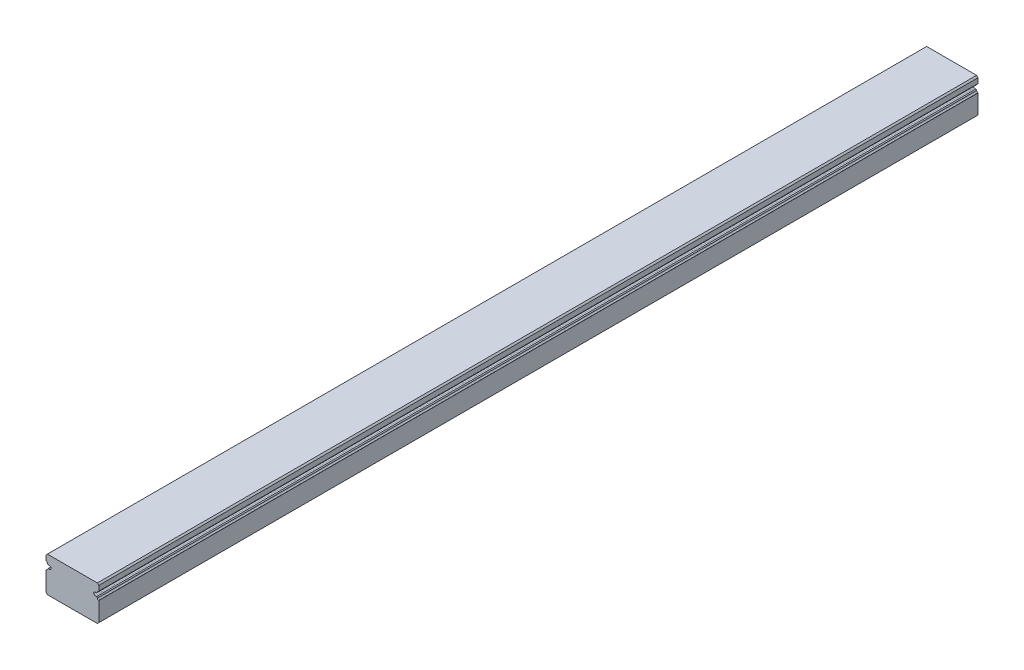
ISO-10303-21;
HEADER;
FILE_DESCRIPTION(('STEP AP214'),'2;1');
FILE_NAME('part.step','',(''),(''),'','','');
FILE_SCHEMA(('AUTOMOTIVE_DESIGN { 1 0 10303 214 1 1 1 1 }'));
ENDSEC;
DATA;
#1=APPLICATION_CONTEXT('core data for automotive mechanical design processes');
#2=APPLICATION_PROTOCOL_DEFINITION('international standard','automotive_design',2000,#1);
#3=PRODUCT_CONTEXT('',#1,'mechanical');
#4=PRODUCT('Part','Part','',(#3));
#5=PRODUCT_RELATED_PRODUCT_CATEGORY('part','',(#4));
#6=PRODUCT_DEFINITION_FORMATION('','',#4);
#7=PRODUCT_DEFINITION_CONTEXT('part definition',#1,'design');
#8=PRODUCT_DEFINITION('design','',#6,#7);
#9=PRODUCT_DEFINITION_SHAPE('','',#8);
#10=(LENGTH_UNIT() NAMED_UNIT(*) SI_UNIT(.MILLI.,.METRE.));
#11=(NAMED_UNIT(*) PLANE_ANGLE_UNIT() SI_UNIT($,.RADIAN.));
#12=(NAMED_UNIT(*) SI_UNIT($,.STERADIAN.) SOLID_ANGLE_UNIT());
#13=UNCERTAINTY_MEASURE_WITH_UNIT(LENGTH_MEASURE(1.E-05),#10,'distance_accuracy_value','');
#14=(GEOMETRIC_REPRESENTATION_CONTEXT(3) GLOBAL_UNCERTAINTY_ASSIGNED_CONTEXT((#13)) GLOBAL_UNIT_ASSIGNED_CONTEXT((#10,
#11,#12)) REPRESENTATION_CONTEXT('',''));
#15=CARTESIAN_POINT('',(0.,0.,0.));
#16=DIRECTION('',(0.,0.,1.));
#17=DIRECTION('',(1.,0.,0.));
#18=AXIS2_PLACEMENT_3D('',#15,#16,#17);
#19=CARTESIAN_POINT('',(7.51952374116363,1.28819952474976,125.));
#20=DIRECTION('',(0.,0.,-1.));
#21=DIRECTION('',(-1.,0.,0.));
#22=AXIS2_PLACEMENT_3D('',#19,#20,#21);
#23=CYLINDRICAL_SURFACE('',#22,0.400000000000003);
#24=CARTESIAN_POINT('',(7.51952374116363,1.28819952474976,-125.));
#25=DIRECTION('',(0.,0.,-1.));
#26=DIRECTION('',(1.,0.,0.));
#27=AXIS2_PLACEMENT_3D('',#24,#25,#26);
#28=CIRCLE('',#27,0.400000000000003);
#29=CARTESIAN_POINT('',(7.4639299734,0.8920816976,-125.));
#30=VERTEX_POINT('',#29);
#31=CARTESIAN_POINT('',(7.1195635475,1.2938425279,-125.));
#32=VERTEX_POINT('',#31);
#33=EDGE_CURVE('E250',#30,#32,#28,.T.);
#34=ORIENTED_EDGE('',*,*,#33,.T.);
#35=DIRECTION('',(0.,0.,-1.));
#36=VECTOR('',#35,1.);
#37=CARTESIAN_POINT('',(7.1195635475,1.2938425279,125.));
#38=LINE('',#37,#36);
#39=CARTESIAN_POINT('',(7.1195635475,1.2938425279,125.));
#40=VERTEX_POINT('',#39);
#41=EDGE_CURVE('E11',#40,#32,#38,.T.);
#42=ORIENTED_EDGE('',*,*,#41,.F.);
#43=CARTESIAN_POINT('',(7.51952374116363,1.28819952474976,125.));
#44=DIRECTION('',(0.,0.,-1.));
#45=DIRECTION('',(1.,0.,0.));
#46=AXIS2_PLACEMENT_3D('',#43,#44,#45);
#47=CIRCLE('',#46,0.400000000000003);
#48=CARTESIAN_POINT('',(7.4639299734,0.8920816976,125.));
#49=VERTEX_POINT('',#48);
#50=EDGE_CURVE('E304',#49,#40,#47,.T.);
#51=ORIENTED_EDGE('',*,*,#50,.F.);
#52=DIRECTION('',(0.,0.,-1.));
#53=VECTOR('',#52,1.);
#54=CARTESIAN_POINT('',(7.4639299734,0.8920816976,125.));
#55=LINE('',#54,#53);
#56=EDGE_CURVE('E246',#49,#30,#55,.T.);
#57=ORIENTED_EDGE('',*,*,#56,.T.);
#58=EDGE_LOOP('',(#34,#42,#51,#57));
#59=FACE_BOUND('',#58,.T.);
#60=ADVANCED_FACE('F34',(#59),#23,.F.);
#61=CARTESIAN_POINT('',(7.1195635475,1.2938425279,125.));
#62=DIRECTION('',(-0.759256602386219,-0.650791373431559,0.));
#63=DIRECTION('',(0.650791373431559,-0.759256602386219,0.));
#64=AXIS2_PLACEMENT_3D('',#61,#62,#63);
#65=PLANE('',#64);
#66=DIRECTION('',(-0.650791373431559,0.759256602386219,0.));
#67=VECTOR('',#66,1.);
#68=CARTESIAN_POINT('',(7.1195635475,1.2938425279,-125.));
#69=LINE('',#68,#67);
#70=CARTESIAN_POINT('',(6.9,1.55,-125.));
#71=VERTEX_POINT('',#70);
#72=EDGE_CURVE('E253',#32,#71,#69,.T.);
#73=ORIENTED_EDGE('',*,*,#72,.T.);
#74=DIRECTION('',(0.,0.,-1.));
#75=VECTOR('',#74,1.);
#76=CARTESIAN_POINT('',(6.9,1.55,125.));
#77=LINE('',#76,#75);
#78=CARTESIAN_POINT('',(6.9,1.55,125.));
#79=VERTEX_POINT('',#78);
#80=EDGE_CURVE('E42',#79,#71,#77,.T.);
#81=ORIENTED_EDGE('',*,*,#80,.F.);
#82=DIRECTION('',(-0.650791373431559,0.759256602386219,0.));
#83=VECTOR('',#82,1.);
#84=CARTESIAN_POINT('',(7.1195635475,1.2938425279,125.));
#85=LINE('',#84,#83);
#86=EDGE_CURVE('E153',#40,#79,#85,.T.);
#87=ORIENTED_EDGE('',*,*,#86,.F.);
#88=ORIENTED_EDGE('',*,*,#41,.T.);
#89=EDGE_LOOP('',(#73,#81,#87,#88));
#90=FACE_BOUND('',#89,.T.);
#91=ADVANCED_FACE('F462',(#90),#65,.F.);
#92=CARTESIAN_POINT('',(6.9,1.55,125.));
#93=DIRECTION('',(0.,-1.,0.));
#94=DIRECTION('',(0.,0.,-1.));
#95=AXIS2_PLACEMENT_3D('',#92,#93,#94);
#96=PLANE('',#95);
#97=DIRECTION('',(-1.,0.,0.));
#98=VECTOR('',#97,1.);
#99=CARTESIAN_POINT('',(6.9,1.55,-125.));
#100=LINE('',#99,#98);
#101=CARTESIAN_POINT('',(6.5,1.55,-125.));
#102=VERTEX_POINT('',#101);
#103=EDGE_CURVE('E255',#71,#102,#100,.T.);
#104=ORIENTED_EDGE('',*,*,#103,.T.);
#105=DIRECTION('',(0.,0.,-1.));
#106=VECTOR('',#105,1.);
#107=CARTESIAN_POINT('',(6.5,1.55,125.));
#108=LINE('',#107,#106);
#109=CARTESIAN_POINT('',(6.5,1.55,125.));
#110=VERTEX_POINT('',#109);
#111=EDGE_CURVE('E371',#110,#102,#108,.T.);
#112=ORIENTED_EDGE('',*,*,#111,.F.);
#113=DIRECTION('',(-1.,0.,0.));
#114=VECTOR('',#113,1.);
#115=CARTESIAN_POINT('',(6.9,1.55,125.));
#116=LINE('',#115,#114);
#117=EDGE_CURVE('E379',#79,#110,#116,.T.);
#118=ORIENTED_EDGE('',*,*,#117,.F.);
#119=ORIENTED_EDGE('',*,*,#80,.T.);
#120=EDGE_LOOP('',(#104,#112,#118,#119));
#121=FACE_BOUND('',#120,.T.);
#122=ADVANCED_FACE('F377',(#121),#96,.F.);
#123=CARTESIAN_POINT('',(6.5,2.,125.));
#124=DIRECTION('',(0.,0.,-1.));
#125=DIRECTION('',(-1.,0.,0.));
#126=AXIS2_PLACEMENT_3D('',#123,#124,#125);
#127=CYLINDRICAL_SURFACE('',#126,0.45);
#128=CARTESIAN_POINT('',(6.5,2.,-125.));
#129=DIRECTION('',(0.,0.,-1.));
#130=DIRECTION('',(1.,0.,0.));
#131=AXIS2_PLACEMENT_3D('',#128,#129,#130);
#132=CIRCLE('',#131,0.45);
#133=CARTESIAN_POINT('',(6.5,2.45,-125.));
#134=VERTEX_POINT('',#133);
#135=EDGE_CURVE('E257',#102,#134,#132,.T.);
#136=ORIENTED_EDGE('',*,*,#135,.T.);
#137=DIRECTION('',(0.,0.,-1.));
#138=VECTOR('',#137,1.);
#139=CARTESIAN_POINT('',(6.5,2.45,125.));
#140=LINE('',#139,#138);
#141=CARTESIAN_POINT('',(6.5,2.45,125.));
#142=VERTEX_POINT('',#141);
#143=EDGE_CURVE('E368',#142,#134,#140,.T.);
#144=ORIENTED_EDGE('',*,*,#143,.F.);
#145=CARTESIAN_POINT('',(6.5,2.,125.));
#146=DIRECTION('',(0.,0.,-1.));
#147=DIRECTION('',(1.,0.,0.));
#148=AXIS2_PLACEMENT_3D('',#145,#146,#147);
#149=CIRCLE('',#148,0.45);
#150=EDGE_CURVE('E397',#110,#142,#149,.T.);
#151=ORIENTED_EDGE('',*,*,#150,.F.);
#152=ORIENTED_EDGE('',*,*,#111,.T.);
#153=EDGE_LOOP('',(#136,#144,#151,#152));
#154=FACE_BOUND('',#153,.T.);
#155=ADVANCED_FACE('F388',(#154),#127,.F.);
#156=CARTESIAN_POINT('',(6.5,2.45,125.));
#157=DIRECTION('',(0.,1.,0.));
#158=DIRECTION('',(0.,0.,1.));
#159=AXIS2_PLACEMENT_3D('',#156,#157,#158);
#160=PLANE('',#159);
#161=DIRECTION('',(1.,0.,0.));
#162=VECTOR('',#161,1.);
#163=CARTESIAN_POINT('',(6.5,2.45,-125.));
#164=LINE('',#163,#162);
#165=CARTESIAN_POINT('',(6.9,2.45,-125.));
#166=VERTEX_POINT('',#165);
#167=EDGE_CURVE('E259',#134,#166,#164,.T.);
#168=ORIENTED_EDGE('',*,*,#167,.T.);
#169=DIRECTION('',(0.,0.,-1.));
#170=VECTOR('',#169,1.);
#171=CARTESIAN_POINT('',(6.9,2.45,125.));
#172=LINE('',#171,#170);
#173=CARTESIAN_POINT('',(6.9,2.45,125.));
#174=VERTEX_POINT('',#173);
#175=EDGE_CURVE('E365',#174,#166,#172,.T.);
#176=ORIENTED_EDGE('',*,*,#175,.F.);
#177=DIRECTION('',(1.,0.,0.));
#178=VECTOR('',#177,1.);
#179=CARTESIAN_POINT('',(6.5,2.45,125.));
#180=LINE('',#179,#178);
#181=EDGE_CURVE('E394',#142,#174,#180,.T.);
#182=ORIENTED_EDGE('',*,*,#181,.F.);
#183=ORIENTED_EDGE('',*,*,#143,.T.);
#184=EDGE_LOOP('',(#168,#176,#182,#183));
#185=FACE_BOUND('',#184,.T.);
#186=ADVANCED_FACE('F392',(#185),#160,.F.);
#187=CARTESIAN_POINT('',(6.9,2.45,125.));
#188=DIRECTION('',(-0.759256602386219,0.65079137343156,0.));
#189=DIRECTION('',(-0.65079137343156,-0.759256602386219,0.));
#190=AXIS2_PLACEMENT_3D('',#187,#188,#189);
#191=PLANE('',#190);
#192=DIRECTION('',(0.65079137343156,0.759256602386219,0.));
#193=VECTOR('',#192,1.);
#194=CARTESIAN_POINT('',(6.9,2.45,-125.));
#195=LINE('',#194,#193);
#196=CARTESIAN_POINT('',(7.1195635475,2.7061574721,-125.));
#197=VERTEX_POINT('',#196);
#198=EDGE_CURVE('E261',#166,#197,#195,.T.);
#199=ORIENTED_EDGE('',*,*,#198,.T.);
#200=DIRECTION('',(0.,0.,-1.));
#201=VECTOR('',#200,1.);
#202=CARTESIAN_POINT('',(7.1195635475,2.7061574721,125.));
#203=LINE('',#202,#201);
#204=CARTESIAN_POINT('',(7.1195635475,2.7061574721,125.));
#205=VERTEX_POINT('',#204);
#206=EDGE_CURVE('E362',#205,#197,#203,.T.);
#207=ORIENTED_EDGE('',*,*,#206,.F.);
#208=DIRECTION('',(0.65079137343156,0.759256602386219,0.));
#209=VECTOR('',#208,1.);
#210=CARTESIAN_POINT('',(6.9,2.45,125.));
#211=LINE('',#210,#209);
#212=EDGE_CURVE('E396',#174,#205,#211,.T.);
#213=ORIENTED_EDGE('',*,*,#212,.F.);
#214=ORIENTED_EDGE('',*,*,#175,.T.);
#215=EDGE_LOOP('',(#199,#207,#213,#214));
#216=FACE_BOUND('',#215,.T.);
#217=ADVANCED_FACE('F475',(#216),#191,.F.);
#218=CARTESIAN_POINT('',(7.51952374116363,2.71180047525024,125.));
#219=DIRECTION('',(0.,0.,-1.));
#220=DIRECTION('',(-1.,0.,0.));
#221=AXIS2_PLACEMENT_3D('',#218,#219,#220);
#222=CYLINDRICAL_SURFACE('',#221,0.400000000000004);
#223=CARTESIAN_POINT('',(7.51952374116363,2.71180047525024,-125.));
#224=DIRECTION('',(0.,0.,-1.));
#225=DIRECTION('',(1.,0.,0.));
#226=AXIS2_PLACEMENT_3D('',#223,#224,#225);
#227=CIRCLE('',#226,0.400000000000004);
#228=CARTESIAN_POINT('',(7.4639299734,3.1079183024,-125.));
#229=VERTEX_POINT('',#228);
#230=EDGE_CURVE('E263',#197,#229,#227,.T.);
#231=ORIENTED_EDGE('',*,*,#230,.T.);
#232=DIRECTION('',(0.,0.,-1.));
#233=VECTOR('',#232,1.);
#234=CARTESIAN_POINT('',(7.4639299734,3.1079183024,125.));
#235=LINE('',#234,#233);
#236=CARTESIAN_POINT('',(7.4639299734,3.1079183024,125.));
#237=VERTEX_POINT('',#236);
#238=EDGE_CURVE('E359',#237,#229,#235,.T.);
#239=ORIENTED_EDGE('',*,*,#238,.F.);
#240=CARTESIAN_POINT('',(7.51952374116363,2.71180047525024,125.));
#241=DIRECTION('',(0.,0.,-1.));
#242=DIRECTION('',(1.,0.,0.));
#243=AXIS2_PLACEMENT_3D('',#240,#241,#242);
#244=CIRCLE('',#243,0.400000000000004);
#245=EDGE_CURVE('E399',#205,#237,#244,.T.);
#246=ORIENTED_EDGE('',*,*,#245,.F.);
#247=ORIENTED_EDGE('',*,*,#206,.T.);
#248=EDGE_LOOP('',(#231,#239,#246,#247));
#249=FACE_BOUND('',#248,.T.);
#250=ADVANCED_FACE('F478',(#249),#222,.F.);
#251=CARTESIAN_POINT('',(7.4639299734,3.1079183024,125.));
#252=DIRECTION('',(-0.759256601601147,0.650791374347476,0.));
#253=DIRECTION('',(-0.650791374347476,-0.759256601601147,0.));
#254=AXIS2_PLACEMENT_3D('',#251,#252,#253);
#255=PLANE('',#254);
#256=DIRECTION('',(0.650791374347476,0.759256601601147,0.));
#257=VECTOR('',#256,1.);
#258=CARTESIAN_POINT('',(7.4639299734,3.1079183024,-125.));
#259=LINE('',#258,#257);
#260=CARTESIAN_POINT('',(7.5,3.15,-125.));
#261=VERTEX_POINT('',#260);
#262=EDGE_CURVE('E265',#229,#261,#259,.T.);
#263=ORIENTED_EDGE('',*,*,#262,.T.);
#264=DIRECTION('',(0.,0.,-1.));
#265=VECTOR('',#264,1.);
#266=CARTESIAN_POINT('',(7.5,3.15,125.));
#267=LINE('',#266,#265);
#268=CARTESIAN_POINT('',(7.5,3.15,125.));
#269=VERTEX_POINT('',#268);
#270=EDGE_CURVE('E356',#269,#261,#267,.T.);
#271=ORIENTED_EDGE('',*,*,#270,.F.);
#272=DIRECTION('',(0.650791374347476,0.759256601601147,0.));
#273=VECTOR('',#272,1.);
#274=CARTESIAN_POINT('',(7.4639299734,3.1079183024,125.));
#275=LINE('',#274,#273);
#276=EDGE_CURVE('E405',#237,#269,#275,.T.);
#277=ORIENTED_EDGE('',*,*,#276,.F.);
#278=ORIENTED_EDGE('',*,*,#238,.T.);
#279=EDGE_LOOP('',(#263,#271,#277,#278));
#280=FACE_BOUND('',#279,.T.);
#281=ADVANCED_FACE('F482',(#280),#255,.F.);
#282=CARTESIAN_POINT('',(7.5,3.15,125.));
#283=DIRECTION('',(-1.,0.,0.));
#284=DIRECTION('',(0.,0.,1.));
#285=AXIS2_PLACEMENT_3D('',#282,#283,#284);
#286=PLANE('',#285);
#287=DIRECTION('',(0.,1.,0.));
#288=VECTOR('',#287,1.);
#289=CARTESIAN_POINT('',(7.5,3.15,-125.));
#290=LINE('',#289,#288);
#291=CARTESIAN_POINT('',(7.5,4.6,-125.));
#292=VERTEX_POINT('',#291);
#293=EDGE_CURVE('E267',#261,#292,#290,.T.);
#294=ORIENTED_EDGE('',*,*,#293,.T.);
#295=DIRECTION('',(0.,0.,-1.));
#296=VECTOR('',#295,1.);
#297=CARTESIAN_POINT('',(7.5,4.6,125.));
#298=LINE('',#297,#296);
#299=CARTESIAN_POINT('',(7.5,4.6,125.));
#300=VERTEX_POINT('',#299);
#301=EDGE_CURVE('E353',#300,#292,#298,.T.);
#302=ORIENTED_EDGE('',*,*,#301,.F.);
#303=DIRECTION('',(0.,1.,0.));
#304=VECTOR('',#303,1.);
#305=CARTESIAN_POINT('',(7.5,3.15,125.));
#306=LINE('',#305,#304);
#307=EDGE_CURVE('E407',#269,#300,#306,.T.);
#308=ORIENTED_EDGE('',*,*,#307,.F.);
#309=ORIENTED_EDGE('',*,*,#270,.T.);
#310=EDGE_LOOP('',(#294,#302,#308,#309));
#311=FACE_BOUND('',#310,.T.);
#312=ADVANCED_FACE('F486',(#311),#286,.F.);
#313=CARTESIAN_POINT('',(7.5,4.6,125.));
#314=DIRECTION('',(-0.707106781186548,-0.707106781186548,0.));
#315=DIRECTION('',(0.707106781186548,-0.707106781186548,0.));
#316=AXIS2_PLACEMENT_3D('',#313,#314,#315);
#317=PLANE('',#316);
#318=DIRECTION('',(-0.707106781186548,0.707106781186548,0.));
#319=VECTOR('',#318,1.);
#320=CARTESIAN_POINT('',(7.5,4.6,-125.));
#321=LINE('',#320,#319);
#322=CARTESIAN_POINT('',(7.1,5.,-125.));
#323=VERTEX_POINT('',#322);
#324=EDGE_CURVE('E269',#292,#323,#321,.T.);
#325=ORIENTED_EDGE('',*,*,#324,.T.);
#326=DIRECTION('',(0.,0.,-1.));
#327=VECTOR('',#326,1.);
#328=CARTESIAN_POINT('',(7.1,5.,125.));
#329=LINE('',#328,#327);
#330=CARTESIAN_POINT('',(7.1,5.,125.));
#331=VERTEX_POINT('',#330);
#332=EDGE_CURVE('E350',#331,#323,#329,.T.);
#333=ORIENTED_EDGE('',*,*,#332,.F.);
#334=DIRECTION('',(-0.707106781186548,0.707106781186548,0.));
#335=VECTOR('',#334,1.);
#336=CARTESIAN_POINT('',(7.5,4.6,125.));
#337=LINE('',#336,#335);
#338=EDGE_CURVE('E409',#300,#331,#337,.T.);
#339=ORIENTED_EDGE('',*,*,#338,.F.);
#340=ORIENTED_EDGE('',*,*,#301,.T.);
#341=EDGE_LOOP('',(#325,#333,#339,#340));
#342=FACE_BOUND('',#341,.T.);
#343=ADVANCED_FACE('F490',(#342),#317,.F.);
#344=CARTESIAN_POINT('',(7.1,5.,125.));
#345=DIRECTION('',(0.,-1.,0.));
#346=DIRECTION('',(0.,0.,-1.));
#347=AXIS2_PLACEMENT_3D('',#344,#345,#346);
#348=PLANE('',#347);
#349=DIRECTION('',(-1.,0.,0.));
#350=VECTOR('',#349,1.);
#351=CARTESIAN_POINT('',(7.1,5.,-125.));
#352=LINE('',#351,#350);
#353=CARTESIAN_POINT('',(-7.1,5.,-125.));
#354=VERTEX_POINT('',#353);
#355=EDGE_CURVE('E271',#323,#354,#352,.T.);
#356=ORIENTED_EDGE('',*,*,#355,.T.);
#357=DIRECTION('',(0.,0.,-1.));
#358=VECTOR('',#357,1.);
#359=CARTESIAN_POINT('',(-7.1,5.,125.));
#360=LINE('',#359,#358);
#361=CARTESIAN_POINT('',(-7.1,5.,125.));
#362=VERTEX_POINT('',#361);
#363=EDGE_CURVE('E347',#362,#354,#360,.T.);
#364=ORIENTED_EDGE('',*,*,#363,.F.);
#365=DIRECTION('',(-1.,0.,0.));
#366=VECTOR('',#365,1.);
#367=CARTESIAN_POINT('',(7.1,5.,125.));
#368=LINE('',#367,#366);
#369=EDGE_CURVE('E411',#331,#362,#368,.T.);
#370=ORIENTED_EDGE('',*,*,#369,.F.);
#371=ORIENTED_EDGE('',*,*,#332,.T.);
#372=EDGE_LOOP('',(#356,#364,#370,#371));
#373=FACE_BOUND('',#372,.T.);
#374=ADVANCED_FACE('F494',(#373),#348,.F.);
#375=CARTESIAN_POINT('',(-7.1,5.,125.));
#376=DIRECTION('',(0.707106781186548,-0.707106781186548,0.));
#377=DIRECTION('',(0.707106781186548,0.707106781186548,0.));
#378=AXIS2_PLACEMENT_3D('',#375,#376,#377);
#379=PLANE('',#378);
#380=DIRECTION('',(-0.707106781186548,-0.707106781186548,0.));
#381=VECTOR('',#380,1.);
#382=CARTESIAN_POINT('',(-7.1,5.,-125.));
#383=LINE('',#382,#381);
#384=CARTESIAN_POINT('',(-7.5,4.6,-125.));
#385=VERTEX_POINT('',#384);
#386=EDGE_CURVE('E273',#354,#385,#383,.T.);
#387=ORIENTED_EDGE('',*,*,#386,.T.);
#388=DIRECTION('',(0.,0.,-1.));
#389=VECTOR('',#388,1.);
#390=CARTESIAN_POINT('',(-7.5,4.6,125.));
#391=LINE('',#390,#389);
#392=CARTESIAN_POINT('',(-7.5,4.6,125.));
#393=VERTEX_POINT('',#392);
#394=EDGE_CURVE('E344',#393,#385,#391,.T.);
#395=ORIENTED_EDGE('',*,*,#394,.F.);
#396=DIRECTION('',(-0.707106781186548,-0.707106781186548,0.));
#397=VECTOR('',#396,1.);
#398=CARTESIAN_POINT('',(-7.1,5.,125.));
#399=LINE('',#398,#397);
#400=EDGE_CURVE('E413',#362,#393,#399,.T.);
#401=ORIENTED_EDGE('',*,*,#400,.F.);
#402=ORIENTED_EDGE('',*,*,#363,.T.);
#403=EDGE_LOOP('',(#387,#395,#401,#402));
#404=FACE_BOUND('',#403,.T.);
#405=ADVANCED_FACE('F498',(#404),#379,.F.);
#406=CARTESIAN_POINT('',(-7.5,4.6,125.));
#407=DIRECTION('',(1.,0.,0.));
#408=DIRECTION('',(0.,0.,-1.));
#409=AXIS2_PLACEMENT_3D('',#406,#407,#408);
#410=PLANE('',#409);
#411=DIRECTION('',(0.,-1.,0.));
#412=VECTOR('',#411,1.);
#413=CARTESIAN_POINT('',(-7.5,4.6,-125.));
#414=LINE('',#413,#412);
#415=CARTESIAN_POINT('',(-7.5,3.15,-125.));
#416=VERTEX_POINT('',#415);
#417=EDGE_CURVE('E275',#385,#416,#414,.T.);
#418=ORIENTED_EDGE('',*,*,#417,.T.);
#419=DIRECTION('',(0.,0.,-1.));
#420=VECTOR('',#419,1.);
#421=CARTESIAN_POINT('',(-7.5,3.15,125.));
#422=LINE('',#421,#420);
#423=CARTESIAN_POINT('',(-7.5,3.15,125.));
#424=VERTEX_POINT('',#423);
#425=EDGE_CURVE('E341',#424,#416,#422,.T.);
#426=ORIENTED_EDGE('',*,*,#425,.F.);
#427=DIRECTION('',(0.,-1.,0.));
#428=VECTOR('',#427,1.);
#429=CARTESIAN_POINT('',(-7.5,4.6,125.));
#430=LINE('',#429,#428);
#431=EDGE_CURVE('E415',#393,#424,#430,.T.);
#432=ORIENTED_EDGE('',*,*,#431,.F.);
#433=ORIENTED_EDGE('',*,*,#394,.T.);
#434=EDGE_LOOP('',(#418,#426,#432,#433));
#435=FACE_BOUND('',#434,.T.);
#436=ADVANCED_FACE('F502',(#435),#410,.F.);
#437=CARTESIAN_POINT('',(-7.5,3.15,125.));
#438=DIRECTION('',(0.759256601601147,0.650791374347476,0.));
#439=DIRECTION('',(-0.650791374347476,0.759256601601147,0.));
#440=AXIS2_PLACEMENT_3D('',#437,#438,#439);
#441=PLANE('',#440);
#442=DIRECTION('',(0.650791374347476,-0.759256601601147,0.));
#443=VECTOR('',#442,1.);
#444=CARTESIAN_POINT('',(-7.5,3.15,-125.));
#445=LINE('',#444,#443);
#446=CARTESIAN_POINT('',(-7.4639299734,3.1079183024,-125.));
#447=VERTEX_POINT('',#446);
#448=EDGE_CURVE('E277',#416,#447,#445,.T.);
#449=ORIENTED_EDGE('',*,*,#448,.T.);
#450=DIRECTION('',(0.,0.,-1.));
#451=VECTOR('',#450,1.);
#452=CARTESIAN_POINT('',(-7.4639299734,3.1079183024,125.));
#453=LINE('',#452,#451);
#454=CARTESIAN_POINT('',(-7.4639299734,3.1079183024,125.));
#455=VERTEX_POINT('',#454);
#456=EDGE_CURVE('E338',#455,#447,#453,.T.);
#457=ORIENTED_EDGE('',*,*,#456,.F.);
#458=DIRECTION('',(0.650791374347476,-0.759256601601147,0.));
#459=VECTOR('',#458,1.);
#460=CARTESIAN_POINT('',(-7.5,3.15,125.));
#461=LINE('',#460,#459);
#462=EDGE_CURVE('E417',#424,#455,#461,.T.);
#463=ORIENTED_EDGE('',*,*,#462,.F.);
#464=ORIENTED_EDGE('',*,*,#425,.T.);
#465=EDGE_LOOP('',(#449,#457,#463,#464));
#466=FACE_BOUND('',#465,.T.);
#467=ADVANCED_FACE('F506',(#466),#441,.F.);
#468=CARTESIAN_POINT('',(-7.51952374116363,2.71180047525024,125.));
#469=DIRECTION('',(0.,0.,-1.));
#470=DIRECTION('',(-1.,0.,0.));
#471=AXIS2_PLACEMENT_3D('',#468,#469,#470);
#472=CYLINDRICAL_SURFACE('',#471,0.400000000000003);
#473=CARTESIAN_POINT('',(-7.51952374116363,2.71180047525024,-125.));
#474=DIRECTION('',(0.,0.,-1.));
#475=DIRECTION('',(1.,0.,0.));
#476=AXIS2_PLACEMENT_3D('',#473,#474,#475);
#477=CIRCLE('',#476,0.400000000000003);
#478=CARTESIAN_POINT('',(-7.1195635475,2.7061574721,-125.));
#479=VERTEX_POINT('',#478);
#480=EDGE_CURVE('E279',#447,#479,#477,.T.);
#481=ORIENTED_EDGE('',*,*,#480,.T.);
#482=DIRECTION('',(0.,0.,-1.));
#483=VECTOR('',#482,1.);
#484=CARTESIAN_POINT('',(-7.1195635475,2.7061574721,125.));
#485=LINE('',#484,#483);
#486=CARTESIAN_POINT('',(-7.1195635475,2.7061574721,125.));
#487=VERTEX_POINT('',#486);
#488=EDGE_CURVE('E335',#487,#479,#485,.T.);
#489=ORIENTED_EDGE('',*,*,#488,.F.);
#490=CARTESIAN_POINT('',(-7.51952374116363,2.71180047525024,125.));
#491=DIRECTION('',(0.,0.,-1.));
#492=DIRECTION('',(1.,0.,0.));
#493=AXIS2_PLACEMENT_3D('',#490,#491,#492);
#494=CIRCLE('',#493,0.400000000000003);
#495=EDGE_CURVE('E419',#455,#487,#494,.T.);
#496=ORIENTED_EDGE('',*,*,#495,.F.);
#497=ORIENTED_EDGE('',*,*,#456,.T.);
#498=EDGE_LOOP('',(#481,#489,#496,#497));
#499=FACE_BOUND('',#498,.T.);
#500=ADVANCED_FACE('F510',(#499),#472,.F.);
#501=CARTESIAN_POINT('',(-7.1195635475,2.7061574721,125.));
#502=DIRECTION('',(0.759256602386219,0.65079137343156,0.));
#503=DIRECTION('',(-0.65079137343156,0.759256602386219,0.));
#504=AXIS2_PLACEMENT_3D('',#501,#502,#503);
#505=PLANE('',#504);
#506=DIRECTION('',(0.65079137343156,-0.759256602386219,0.));
#507=VECTOR('',#506,1.);
#508=CARTESIAN_POINT('',(-7.1195635475,2.7061574721,-125.));
#509=LINE('',#508,#507);
#510=CARTESIAN_POINT('',(-6.9,2.45,-125.));
#511=VERTEX_POINT('',#510);
#512=EDGE_CURVE('E281',#479,#511,#509,.T.);
#513=ORIENTED_EDGE('',*,*,#512,.T.);
#514=DIRECTION('',(0.,0.,-1.));
#515=VECTOR('',#514,1.);
#516=CARTESIAN_POINT('',(-6.9,2.45,125.));
#517=LINE('',#516,#515);
#518=CARTESIAN_POINT('',(-6.9,2.45,125.));
#519=VERTEX_POINT('',#518);
#520=EDGE_CURVE('E332',#519,#511,#517,.T.);
#521=ORIENTED_EDGE('',*,*,#520,.F.);
#522=DIRECTION('',(0.65079137343156,-0.759256602386219,0.));
#523=VECTOR('',#522,1.);
#524=CARTESIAN_POINT('',(-7.1195635475,2.7061574721,125.));
#525=LINE('',#524,#523);
#526=EDGE_CURVE('E421',#487,#519,#525,.T.);
#527=ORIENTED_EDGE('',*,*,#526,.F.);
#528=ORIENTED_EDGE('',*,*,#488,.T.);
#529=EDGE_LOOP('',(#513,#521,#527,#528));
#530=FACE_BOUND('',#529,.T.);
#531=ADVANCED_FACE('F514',(#530),#505,.F.);
#532=CARTESIAN_POINT('',(-6.9,2.45,125.));
#533=DIRECTION('',(0.,1.,0.));
#534=DIRECTION('',(0.,0.,1.));
#535=AXIS2_PLACEMENT_3D('',#532,#533,#534);
#536=PLANE('',#535);
#537=DIRECTION('',(1.,0.,0.));
#538=VECTOR('',#537,1.);
#539=CARTESIAN_POINT('',(-6.9,2.45,-125.));
#540=LINE('',#539,#538);
#541=CARTESIAN_POINT('',(-6.5,2.45,-125.));
#542=VERTEX_POINT('',#541);
#543=EDGE_CURVE('E283',#511,#542,#540,.T.);
#544=ORIENTED_EDGE('',*,*,#543,.T.);
#545=DIRECTION('',(0.,0.,-1.));
#546=VECTOR('',#545,1.);
#547=CARTESIAN_POINT('',(-6.5,2.45,125.));
#548=LINE('',#547,#546);
#549=CARTESIAN_POINT('',(-6.5,2.45,125.));
#550=VERTEX_POINT('',#549);
#551=EDGE_CURVE('E329',#550,#542,#548,.T.);
#552=ORIENTED_EDGE('',*,*,#551,.F.);
#553=DIRECTION('',(1.,0.,0.));
#554=VECTOR('',#553,1.);
#555=CARTESIAN_POINT('',(-6.9,2.45,125.));
#556=LINE('',#555,#554);
#557=EDGE_CURVE('E423',#519,#550,#556,.T.);
#558=ORIENTED_EDGE('',*,*,#557,.F.);
#559=ORIENTED_EDGE('',*,*,#520,.T.);
#560=EDGE_LOOP('',(#544,#552,#558,#559));
#561=FACE_BOUND('',#560,.T.);
#562=ADVANCED_FACE('F518',(#561),#536,.F.);
#563=CARTESIAN_POINT('',(-6.5,2.,125.));
#564=DIRECTION('',(0.,0.,-1.));
#565=DIRECTION('',(-1.,0.,0.));
#566=AXIS2_PLACEMENT_3D('',#563,#564,#565);
#567=CYLINDRICAL_SURFACE('',#566,0.45);
#568=CARTESIAN_POINT('',(-6.5,2.,-125.));
#569=DIRECTION('',(0.,0.,-1.));
#570=DIRECTION('',(1.,0.,0.));
#571=AXIS2_PLACEMENT_3D('',#568,#569,#570);
#572=CIRCLE('',#571,0.45);
#573=CARTESIAN_POINT('',(-6.5,1.55,-125.));
#574=VERTEX_POINT('',#573);
#575=EDGE_CURVE('E285',#542,#574,#572,.T.);
#576=ORIENTED_EDGE('',*,*,#575,.T.);
#577=DIRECTION('',(0.,0.,-1.));
#578=VECTOR('',#577,1.);
#579=CARTESIAN_POINT('',(-6.5,1.55,125.));
#580=LINE('',#579,#578);
#581=CARTESIAN_POINT('',(-6.5,1.55,125.));
#582=VERTEX_POINT('',#581);
#583=EDGE_CURVE('E326',#582,#574,#580,.T.);
#584=ORIENTED_EDGE('',*,*,#583,.F.);
#585=CARTESIAN_POINT('',(-6.5,2.,125.));
#586=DIRECTION('',(0.,0.,-1.));
#587=DIRECTION('',(1.,0.,0.));
#588=AXIS2_PLACEMENT_3D('',#585,#586,#587);
#589=CIRCLE('',#588,0.45);
#590=EDGE_CURVE('E425',#550,#582,#589,.T.);
#591=ORIENTED_EDGE('',*,*,#590,.F.);
#592=ORIENTED_EDGE('',*,*,#551,.T.);
#593=EDGE_LOOP('',(#576,#584,#591,#592));
#594=FACE_BOUND('',#593,.T.);
#595=ADVANCED_FACE('F522',(#594),#567,.F.);
#596=CARTESIAN_POINT('',(-6.5,1.55,125.));
#597=DIRECTION('',(0.,-1.,0.));
#598=DIRECTION('',(0.,0.,-1.));
#599=AXIS2_PLACEMENT_3D('',#596,#597,#598);
#600=PLANE('',#599);
#601=DIRECTION('',(-1.,0.,0.));
#602=VECTOR('',#601,1.);
#603=CARTESIAN_POINT('',(-6.5,1.55,-125.));
#604=LINE('',#603,#602);
#605=CARTESIAN_POINT('',(-6.9,1.55,-125.));
#606=VERTEX_POINT('',#605);
#607=EDGE_CURVE('E287',#574,#606,#604,.T.);
#608=ORIENTED_EDGE('',*,*,#607,.T.);
#609=DIRECTION('',(0.,0.,-1.));
#610=VECTOR('',#609,1.);
#611=CARTESIAN_POINT('',(-6.9,1.55,125.));
#612=LINE('',#611,#610);
#613=CARTESIAN_POINT('',(-6.9,1.55,125.));
#614=VERTEX_POINT('',#613);
#615=EDGE_CURVE('E323',#614,#606,#612,.T.);
#616=ORIENTED_EDGE('',*,*,#615,.F.);
#617=DIRECTION('',(-1.,0.,0.));
#618=VECTOR('',#617,1.);
#619=CARTESIAN_POINT('',(-6.5,1.55,125.));
#620=LINE('',#619,#618);
#621=EDGE_CURVE('E427',#582,#614,#620,.T.);
#622=ORIENTED_EDGE('',*,*,#621,.F.);
#623=ORIENTED_EDGE('',*,*,#583,.T.);
#624=EDGE_LOOP('',(#608,#616,#622,#623));
#625=FACE_BOUND('',#624,.T.);
#626=ADVANCED_FACE('F526',(#625),#600,.F.);
#627=CARTESIAN_POINT('',(-6.9,1.55,125.));
#628=DIRECTION('',(0.759256602386219,-0.650791373431559,0.));
#629=DIRECTION('',(0.650791373431559,0.759256602386219,0.));
#630=AXIS2_PLACEMENT_3D('',#627,#628,#629);
#631=PLANE('',#630);
#632=DIRECTION('',(-0.650791373431559,-0.759256602386219,0.));
#633=VECTOR('',#632,1.);
#634=CARTESIAN_POINT('',(-6.9,1.55,-125.));
#635=LINE('',#634,#633);
#636=CARTESIAN_POINT('',(-7.1195635475,1.2938425279,-125.));
#637=VERTEX_POINT('',#636);
#638=EDGE_CURVE('E289',#606,#637,#635,.T.);
#639=ORIENTED_EDGE('',*,*,#638,.T.);
#640=DIRECTION('',(0.,0.,-1.));
#641=VECTOR('',#640,1.);
#642=CARTESIAN_POINT('',(-7.1195635475,1.2938425279,125.));
#643=LINE('',#642,#641);
#644=CARTESIAN_POINT('',(-7.1195635475,1.2938425279,125.));
#645=VERTEX_POINT('',#644);
#646=EDGE_CURVE('E320',#645,#637,#643,.T.);
#647=ORIENTED_EDGE('',*,*,#646,.F.);
#648=DIRECTION('',(-0.650791373431559,-0.759256602386219,0.));
#649=VECTOR('',#648,1.);
#650=CARTESIAN_POINT('',(-6.9,1.55,125.));
#651=LINE('',#650,#649);
#652=EDGE_CURVE('E429',#614,#645,#651,.T.);
#653=ORIENTED_EDGE('',*,*,#652,.F.);
#654=ORIENTED_EDGE('',*,*,#615,.T.);
#655=EDGE_LOOP('',(#639,#647,#653,#654));
#656=FACE_BOUND('',#655,.T.);
#657=ADVANCED_FACE('F530',(#656),#631,.F.);
#658=CARTESIAN_POINT('',(-7.51952374116363,1.28819952474976,125.));
#659=DIRECTION('',(0.,0.,-1.));
#660=DIRECTION('',(-1.,0.,0.));
#661=AXIS2_PLACEMENT_3D('',#658,#659,#660);
#662=CYLINDRICAL_SURFACE('',#661,0.400000000000003);
#663=CARTESIAN_POINT('',(-7.51952374116363,1.28819952474976,-125.));
#664=DIRECTION('',(0.,0.,-1.));
#665=DIRECTION('',(1.,0.,0.));
#666=AXIS2_PLACEMENT_3D('',#663,#664,#665);
#667=CIRCLE('',#666,0.400000000000003);
#668=CARTESIAN_POINT('',(-7.4639299734,0.8920816976,-125.));
#669=VERTEX_POINT('',#668);
#670=EDGE_CURVE('E291',#637,#669,#667,.T.);
#671=ORIENTED_EDGE('',*,*,#670,.T.);
#672=DIRECTION('',(0.,0.,-1.));
#673=VECTOR('',#672,1.);
#674=CARTESIAN_POINT('',(-7.4639299734,0.8920816976,125.));
#675=LINE('',#674,#673);
#676=CARTESIAN_POINT('',(-7.4639299734,0.8920816976,125.));
#677=VERTEX_POINT('',#676);
#678=EDGE_CURVE('E317',#677,#669,#675,.T.);
#679=ORIENTED_EDGE('',*,*,#678,.F.);
#680=CARTESIAN_POINT('',(-7.51952374116363,1.28819952474976,125.));
#681=DIRECTION('',(0.,0.,-1.));
#682=DIRECTION('',(1.,0.,0.));
#683=AXIS2_PLACEMENT_3D('',#680,#681,#682);
#684=CIRCLE('',#683,0.400000000000003);
#685=EDGE_CURVE('E431',#645,#677,#684,.T.);
#686=ORIENTED_EDGE('',*,*,#685,.F.);
#687=ORIENTED_EDGE('',*,*,#646,.T.);
#688=EDGE_LOOP('',(#671,#679,#686,#687));
#689=FACE_BOUND('',#688,.T.);
#690=ADVANCED_FACE('F534',(#689),#662,.F.);
#691=CARTESIAN_POINT('',(-7.4639299734,0.8920816976,125.));
#692=DIRECTION('',(0.759256601601146,-0.650791374347477,0.));
#693=DIRECTION('',(0.650791374347477,0.759256601601146,0.));
#694=AXIS2_PLACEMENT_3D('',#691,#692,#693);
#695=PLANE('',#694);
#696=DIRECTION('',(-0.650791374347477,-0.759256601601146,0.));
#697=VECTOR('',#696,1.);
#698=CARTESIAN_POINT('',(-7.4639299734,0.8920816976,-125.));
#699=LINE('',#698,#697);
#700=CARTESIAN_POINT('',(-7.5,0.85,-125.));
#701=VERTEX_POINT('',#700);
#702=EDGE_CURVE('E293',#669,#701,#699,.T.);
#703=ORIENTED_EDGE('',*,*,#702,.T.);
#704=DIRECTION('',(0.,0.,-1.));
#705=VECTOR('',#704,1.);
#706=CARTESIAN_POINT('',(-7.5,0.85,125.));
#707=LINE('',#706,#705);
#708=CARTESIAN_POINT('',(-7.5,0.85,125.));
#709=VERTEX_POINT('',#708);
#710=EDGE_CURVE('E314',#709,#701,#707,.T.);
#711=ORIENTED_EDGE('',*,*,#710,.F.);
#712=DIRECTION('',(-0.650791374347477,-0.759256601601146,0.));
#713=VECTOR('',#712,1.);
#714=CARTESIAN_POINT('',(-7.4639299734,0.8920816976,125.));
#715=LINE('',#714,#713);
#716=EDGE_CURVE('E433',#677,#709,#715,.T.);
#717=ORIENTED_EDGE('',*,*,#716,.F.);
#718=ORIENTED_EDGE('',*,*,#678,.T.);
#719=EDGE_LOOP('',(#703,#711,#717,#718));
#720=FACE_BOUND('',#719,.T.);
#721=ADVANCED_FACE('F538',(#720),#695,.F.);
#722=CARTESIAN_POINT('',(-7.5,0.85,125.));
#723=DIRECTION('',(1.,0.,0.));
#724=DIRECTION('',(0.,0.,-1.));
#725=AXIS2_PLACEMENT_3D('',#722,#723,#724);
#726=PLANE('',#725);
#727=DIRECTION('',(0.,-1.,0.));
#728=VECTOR('',#727,1.);
#729=CARTESIAN_POINT('',(-7.5,0.85,-125.));
#730=LINE('',#729,#728);
#731=CARTESIAN_POINT('',(-7.5,-4.6,-125.));
#732=VERTEX_POINT('',#731);
#733=EDGE_CURVE('E295',#701,#732,#730,.T.);
#734=ORIENTED_EDGE('',*,*,#733,.T.);
#735=DIRECTION('',(0.,0.,-1.));
#736=VECTOR('',#735,1.);
#737=CARTESIAN_POINT('',(-7.5,-4.6,125.));
#738=LINE('',#737,#736);
#739=CARTESIAN_POINT('',(-7.5,-4.6,125.));
#740=VERTEX_POINT('',#739);
#741=EDGE_CURVE('E311',#740,#732,#738,.T.);
#742=ORIENTED_EDGE('',*,*,#741,.F.);
#743=DIRECTION('',(0.,-1.,0.));
#744=VECTOR('',#743,1.);
#745=CARTESIAN_POINT('',(-7.5,0.85,125.));
#746=LINE('',#745,#744);
#747=EDGE_CURVE('E435',#709,#740,#746,.T.);
#748=ORIENTED_EDGE('',*,*,#747,.F.);
#749=ORIENTED_EDGE('',*,*,#710,.T.);
#750=EDGE_LOOP('',(#734,#742,#748,#749));
#751=FACE_BOUND('',#750,.T.);
#752=ADVANCED_FACE('F542',(#751),#726,.F.);
#753=CARTESIAN_POINT('',(-7.5,-4.6,125.));
#754=DIRECTION('',(0.707106781186548,0.707106781186548,0.));
#755=DIRECTION('',(-0.707106781186548,0.707106781186548,0.));
#756=AXIS2_PLACEMENT_3D('',#753,#754,#755);
#757=PLANE('',#756);
#758=DIRECTION('',(0.707106781186548,-0.707106781186548,0.));
#759=VECTOR('',#758,1.);
#760=CARTESIAN_POINT('',(-7.5,-4.6,-125.));
#761=LINE('',#760,#759);
#762=CARTESIAN_POINT('',(-7.1,-5.,-125.));
#763=VERTEX_POINT('',#762);
#764=EDGE_CURVE('E297',#732,#763,#761,.T.);
#765=ORIENTED_EDGE('',*,*,#764,.T.);
#766=DIRECTION('',(0.,0.,-1.));
#767=VECTOR('',#766,1.);
#768=CARTESIAN_POINT('',(-7.1,-5.,125.));
#769=LINE('',#768,#767);
#770=CARTESIAN_POINT('',(-7.1,-5.,125.));
#771=VERTEX_POINT('',#770);
#772=EDGE_CURVE('E308',#771,#763,#769,.T.);
#773=ORIENTED_EDGE('',*,*,#772,.F.);
#774=DIRECTION('',(0.707106781186548,-0.707106781186548,0.));
#775=VECTOR('',#774,1.);
#776=CARTESIAN_POINT('',(-7.5,-4.6,125.));
#777=LINE('',#776,#775);
#778=EDGE_CURVE('E437',#740,#771,#777,.T.);
#779=ORIENTED_EDGE('',*,*,#778,.F.);
#780=ORIENTED_EDGE('',*,*,#741,.T.);
#781=EDGE_LOOP('',(#765,#773,#779,#780));
#782=FACE_BOUND('',#781,.T.);
#783=ADVANCED_FACE('F443',(#782),#757,.F.);
#784=CARTESIAN_POINT('',(-7.1,-5.,125.));
#785=DIRECTION('',(0.,1.,0.));
#786=DIRECTION('',(0.,0.,1.));
#787=AXIS2_PLACEMENT_3D('',#784,#785,#786);
#788=PLANE('',#787);
#789=DIRECTION('',(1.,0.,0.));
#790=VECTOR('',#789,1.);
#791=CARTESIAN_POINT('',(-7.1,-5.,-125.));
#792=LINE('',#791,#790);
#793=CARTESIAN_POINT('',(7.1,-5.,-125.));
#794=VERTEX_POINT('',#793);
#795=EDGE_CURVE('E299',#763,#794,#792,.T.);
#796=ORIENTED_EDGE('',*,*,#795,.T.);
#797=DIRECTION('',(0.,0.,-1.));
#798=VECTOR('',#797,1.);
#799=CARTESIAN_POINT('',(7.1,-5.,125.));
#800=LINE('',#799,#798);
#801=CARTESIAN_POINT('',(7.1,-5.,125.));
#802=VERTEX_POINT('',#801);
#803=EDGE_CURVE('E241',#802,#794,#800,.T.);
#804=ORIENTED_EDGE('',*,*,#803,.F.);
#805=DIRECTION('',(1.,0.,0.));
#806=VECTOR('',#805,1.);
#807=CARTESIAN_POINT('',(-7.1,-5.,125.));
#808=LINE('',#807,#806);
#809=EDGE_CURVE('E232',#771,#802,#808,.T.);
#810=ORIENTED_EDGE('',*,*,#809,.F.);
#811=ORIENTED_EDGE('',*,*,#772,.T.);
#812=EDGE_LOOP('',(#796,#804,#810,#811));
#813=FACE_BOUND('',#812,.T.);
#814=ADVANCED_FACE('F447',(#813),#788,.F.);
#815=CARTESIAN_POINT('',(7.1,-5.,125.));
#816=DIRECTION('',(-0.707106781186548,0.707106781186548,0.));
#817=DIRECTION('',(-0.707106781186548,-0.707106781186548,0.));
#818=AXIS2_PLACEMENT_3D('',#815,#816,#817);
#819=PLANE('',#818);
#820=DIRECTION('',(0.707106781186548,0.707106781186548,0.));
#821=VECTOR('',#820,1.);
#822=CARTESIAN_POINT('',(7.1,-5.,-125.));
#823=LINE('',#822,#821);
#824=CARTESIAN_POINT('',(7.5,-4.6,-125.));
#825=VERTEX_POINT('',#824);
#826=EDGE_CURVE('E240',#794,#825,#823,.T.);
#827=ORIENTED_EDGE('',*,*,#826,.T.);
#828=DIRECTION('',(0.,0.,-1.));
#829=VECTOR('',#828,1.);
#830=CARTESIAN_POINT('',(7.5,-4.6,125.));
#831=LINE('',#830,#829);
#832=CARTESIAN_POINT('',(7.5,-4.6,125.));
#833=VERTEX_POINT('',#832);
#834=EDGE_CURVE('E237',#833,#825,#831,.T.);
#835=ORIENTED_EDGE('',*,*,#834,.F.);
#836=DIRECTION('',(0.707106781186548,0.707106781186548,0.));
#837=VECTOR('',#836,1.);
#838=CARTESIAN_POINT('',(7.1,-5.,125.));
#839=LINE('',#838,#837);
#840=EDGE_CURVE('E226',#802,#833,#839,.T.);
#841=ORIENTED_EDGE('',*,*,#840,.F.);
#842=ORIENTED_EDGE('',*,*,#803,.T.);
#843=EDGE_LOOP('',(#827,#835,#841,#842));
#844=FACE_BOUND('',#843,.T.);
#845=ADVANCED_FACE('F238',(#844),#819,.F.);
#846=CARTESIAN_POINT('',(7.5,-4.6,125.));
#847=DIRECTION('',(-1.,0.,0.));
#848=DIRECTION('',(0.,0.,1.));
#849=AXIS2_PLACEMENT_3D('',#846,#847,#848);
#850=PLANE('',#849);
#851=DIRECTION('',(0.,1.,0.));
#852=VECTOR('',#851,1.);
#853=CARTESIAN_POINT('',(7.5,-4.6,-125.));
#854=LINE('',#853,#852);
#855=CARTESIAN_POINT('',(7.5,0.85,-125.));
#856=VERTEX_POINT('',#855);
#857=EDGE_CURVE('E139',#825,#856,#854,.T.);
#858=ORIENTED_EDGE('',*,*,#857,.T.);
#859=DIRECTION('',(0.,0.,-1.));
#860=VECTOR('',#859,1.);
#861=CARTESIAN_POINT('',(7.5,0.85,125.));
#862=LINE('',#861,#860);
#863=CARTESIAN_POINT('',(7.5,0.85,125.));
#864=VERTEX_POINT('',#863);
#865=EDGE_CURVE('E242',#864,#856,#862,.T.);
#866=ORIENTED_EDGE('',*,*,#865,.F.);
#867=DIRECTION('',(0.,1.,0.));
#868=VECTOR('',#867,1.);
#869=CARTESIAN_POINT('',(7.5,-4.6,125.));
#870=LINE('',#869,#868);
#871=EDGE_CURVE('E230',#833,#864,#870,.T.);
#872=ORIENTED_EDGE('',*,*,#871,.F.);
#873=ORIENTED_EDGE('',*,*,#834,.T.);
#874=EDGE_LOOP('',(#858,#866,#872,#873));
#875=FACE_BOUND('',#874,.T.);
#876=ADVANCED_FACE('F244',(#875),#850,.F.);
#877=CARTESIAN_POINT('',(7.5,0.85,125.));
#878=DIRECTION('',(-0.759256601601146,-0.650791374347477,0.));
#879=DIRECTION('',(0.650791374347477,-0.759256601601146,0.));
#880=AXIS2_PLACEMENT_3D('',#877,#878,#879);
#881=PLANE('',#880);
#882=DIRECTION('',(-0.650791374347477,0.759256601601146,0.));
#883=VECTOR('',#882,1.);
#884=CARTESIAN_POINT('',(7.5,0.85,-125.));
#885=LINE('',#884,#883);
#886=EDGE_CURVE('E145',#856,#30,#885,.T.);
#887=ORIENTED_EDGE('',*,*,#886,.T.);
#888=ORIENTED_EDGE('',*,*,#56,.F.);
#889=DIRECTION('',(-0.650791374347477,0.759256601601146,0.));
#890=VECTOR('',#889,1.);
#891=CARTESIAN_POINT('',(7.5,0.85,125.));
#892=LINE('',#891,#890);
#893=EDGE_CURVE('E50',#864,#49,#892,.T.);
#894=ORIENTED_EDGE('',*,*,#893,.F.);
#895=ORIENTED_EDGE('',*,*,#865,.T.);
#896=EDGE_LOOP('',(#887,#888,#894,#895));
#897=FACE_BOUND('',#896,.T.);
#898=ADVANCED_FACE('F451',(#897),#881,.F.);
#899=CARTESIAN_POINT('',(7.51952374116363,1.28819952474976,125.));
#900=DIRECTION('',(0.,0.,1.));
#901=DIRECTION('',(1.,0.,0.));
#902=AXIS2_PLACEMENT_3D('',#899,#900,#901);
#903=PLANE('',#902);
#904=ORIENTED_EDGE('',*,*,#50,.T.);
#905=ORIENTED_EDGE('',*,*,#86,.T.);
#906=ORIENTED_EDGE('',*,*,#117,.T.);
#907=ORIENTED_EDGE('',*,*,#150,.T.);
#908=ORIENTED_EDGE('',*,*,#181,.T.);
#909=ORIENTED_EDGE('',*,*,#212,.T.);
#910=ORIENTED_EDGE('',*,*,#245,.T.);
#911=ORIENTED_EDGE('',*,*,#276,.T.);
#912=ORIENTED_EDGE('',*,*,#307,.T.);
#913=ORIENTED_EDGE('',*,*,#338,.T.);
#914=ORIENTED_EDGE('',*,*,#369,.T.);
#915=ORIENTED_EDGE('',*,*,#400,.T.);
#916=ORIENTED_EDGE('',*,*,#431,.T.);
#917=ORIENTED_EDGE('',*,*,#462,.T.);
#918=ORIENTED_EDGE('',*,*,#495,.T.);
#919=ORIENTED_EDGE('',*,*,#526,.T.);
#920=ORIENTED_EDGE('',*,*,#557,.T.);
#921=ORIENTED_EDGE('',*,*,#590,.T.);
#922=ORIENTED_EDGE('',*,*,#621,.T.);
#923=ORIENTED_EDGE('',*,*,#652,.T.);
#924=ORIENTED_EDGE('',*,*,#685,.T.);
#925=ORIENTED_EDGE('',*,*,#716,.T.);
#926=ORIENTED_EDGE('',*,*,#747,.T.);
#927=ORIENTED_EDGE('',*,*,#778,.T.);
#928=ORIENTED_EDGE('',*,*,#809,.T.);
#929=ORIENTED_EDGE('',*,*,#840,.T.);
#930=ORIENTED_EDGE('',*,*,#871,.T.);
#931=ORIENTED_EDGE('',*,*,#893,.T.);
#932=EDGE_LOOP('',(#904,#905,#906,#907,#908,#909,#910,#911,#912,#913,#914,#915,#916,#917,#918,
#919,#920,#921,#922,#923,#924,#925,#926,#927,#928,#929,#930,#931));
#933=FACE_BOUND('',#932,.T.);
#934=ADVANCED_FACE('F228',(#933),#903,.T.);
#935=CARTESIAN_POINT('',(7.51952374116363,1.28819952474976,-125.));
#936=DIRECTION('',(0.,0.,1.));
#937=DIRECTION('',(1.,0.,0.));
#938=AXIS2_PLACEMENT_3D('',#935,#936,#937);
#939=PLANE('',#938);
#940=ORIENTED_EDGE('',*,*,#33,.F.);
#941=ORIENTED_EDGE('',*,*,#886,.F.);
#942=ORIENTED_EDGE('',*,*,#857,.F.);
#943=ORIENTED_EDGE('',*,*,#826,.F.);
#944=ORIENTED_EDGE('',*,*,#795,.F.);
#945=ORIENTED_EDGE('',*,*,#764,.F.);
#946=ORIENTED_EDGE('',*,*,#733,.F.);
#947=ORIENTED_EDGE('',*,*,#702,.F.);
#948=ORIENTED_EDGE('',*,*,#670,.F.);
#949=ORIENTED_EDGE('',*,*,#638,.F.);
#950=ORIENTED_EDGE('',*,*,#607,.F.);
#951=ORIENTED_EDGE('',*,*,#575,.F.);
#952=ORIENTED_EDGE('',*,*,#543,.F.);
#953=ORIENTED_EDGE('',*,*,#512,.F.);
#954=ORIENTED_EDGE('',*,*,#480,.F.);
#955=ORIENTED_EDGE('',*,*,#448,.F.);
#956=ORIENTED_EDGE('',*,*,#417,.F.);
#957=ORIENTED_EDGE('',*,*,#386,.F.);
#958=ORIENTED_EDGE('',*,*,#355,.F.);
#959=ORIENTED_EDGE('',*,*,#324,.F.);
#960=ORIENTED_EDGE('',*,*,#293,.F.);
#961=ORIENTED_EDGE('',*,*,#262,.F.);
#962=ORIENTED_EDGE('',*,*,#230,.F.);
#963=ORIENTED_EDGE('',*,*,#198,.F.);
#964=ORIENTED_EDGE('',*,*,#167,.F.);
#965=ORIENTED_EDGE('',*,*,#135,.F.);
#966=ORIENTED_EDGE('',*,*,#103,.F.);
#967=ORIENTED_EDGE('',*,*,#72,.F.);
#968=EDGE_LOOP('',(#940,#941,#942,#943,#944,#945,#946,#947,#948,#949,#950,#951,#952,#953,#954,
#955,#956,#957,#958,#959,#960,#961,#962,#963,#964,#965,#966,#967));
#969=FACE_BOUND('',#968,.T.);
#970=ADVANCED_FACE('F383',(#969),#939,.F.);
#971=CLOSED_SHELL('',(#60,#91,#122,#155,#186,#217,#250,#281,#312,#343,#374,#405,#436,#467,#500,
#531,#562,#595,#626,#657,#690,#721,#752,#783,#814,#845,#876,#898,#934,#970));
#972=MANIFOLD_SOLID_BREP('B2',#971);
#973=ADVANCED_BREP_SHAPE_REPRESENTATION('',(#18,#972),#14);
#974=SHAPE_DEFINITION_REPRESENTATION(#9,#973);
ENDSEC;
END-ISO-10303-21;
